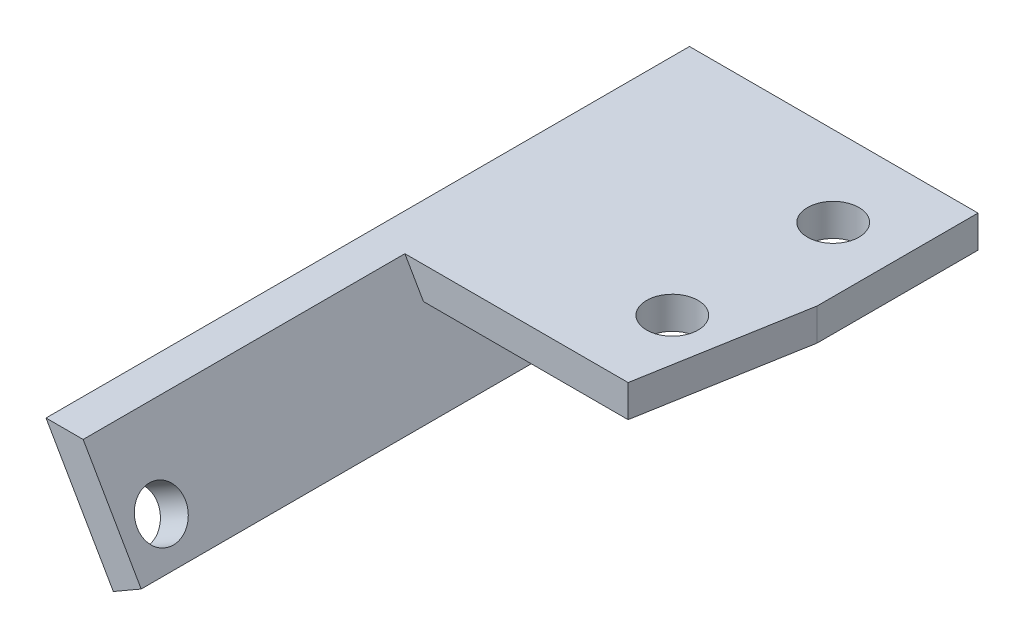
ISO-10303-21;
HEADER;
FILE_DESCRIPTION(('STEP AP214'),'2;1');
FILE_NAME('part.step','',(''),(''),'','','');
FILE_SCHEMA(('AUTOMOTIVE_DESIGN { 1 0 10303 214 1 1 1 1 }'));
ENDSEC;
DATA;
#1=APPLICATION_CONTEXT('core data for automotive mechanical design processes');
#2=APPLICATION_PROTOCOL_DEFINITION('international standard','automotive_design',2000,#1);
#3=PRODUCT_CONTEXT('',#1,'mechanical');
#4=PRODUCT('Part','Part','',(#3));
#5=PRODUCT_RELATED_PRODUCT_CATEGORY('part','',(#4));
#6=PRODUCT_DEFINITION_FORMATION('','',#4);
#7=PRODUCT_DEFINITION_CONTEXT('part definition',#1,'design');
#8=PRODUCT_DEFINITION('design','',#6,#7);
#9=PRODUCT_DEFINITION_SHAPE('','',#8);
#10=(LENGTH_UNIT() NAMED_UNIT(*) SI_UNIT(.MILLI.,.METRE.));
#11=(NAMED_UNIT(*) PLANE_ANGLE_UNIT() SI_UNIT($,.RADIAN.));
#12=(NAMED_UNIT(*) SI_UNIT($,.STERADIAN.) SOLID_ANGLE_UNIT());
#13=UNCERTAINTY_MEASURE_WITH_UNIT(LENGTH_MEASURE(1.E-05),#10,'distance_accuracy_value','');
#14=(GEOMETRIC_REPRESENTATION_CONTEXT(3) GLOBAL_UNCERTAINTY_ASSIGNED_CONTEXT((#13)) GLOBAL_UNIT_ASSIGNED_CONTEXT((#10,
#11,#12)) REPRESENTATION_CONTEXT('',''));
#15=CARTESIAN_POINT('',(0.,0.,0.));
#16=DIRECTION('',(0.,0.,1.));
#17=DIRECTION('',(1.,0.,0.));
#18=AXIS2_PLACEMENT_3D('',#15,#16,#17);
#19=CARTESIAN_POINT('',(0.,0.,20.));
#20=DIRECTION('',(-0.500000000000004,0.866025403784436,0.));
#21=DIRECTION('',(-0.866025403784436,-0.500000000000004,0.));
#22=AXIS2_PLACEMENT_3D('',#19,#20,#21);
#23=PLANE('',#22);
#24=DIRECTION('',(0.866025403784436,0.500000000000004,0.));
#25=VECTOR('',#24,1.);
#26=CARTESIAN_POINT('',(0.,0.,0.));
#27=LINE('',#26,#25);
#28=CARTESIAN_POINT('',(0.,0.,0.));
#29=VERTEX_POINT('',#28);
#30=CARTESIAN_POINT('',(1.73205080756887,1.00000000000001,0.));
#31=VERTEX_POINT('',#30);
#32=EDGE_CURVE('E107',#29,#31,#27,.T.);
#33=ORIENTED_EDGE('',*,*,#32,.T.);
#34=DIRECTION('',(0.,0.,-1.));
#35=VECTOR('',#34,1.);
#36=CARTESIAN_POINT('',(1.73205080756887,1.00000000000001,20.));
#37=LINE('',#36,#35);
#38=CARTESIAN_POINT('',(1.73205080756887,1.00000000000001,40.));
#39=VERTEX_POINT('',#38);
#40=EDGE_CURVE('E120',#39,#31,#37,.T.);
#41=ORIENTED_EDGE('',*,*,#40,.F.);
#42=DIRECTION('',(0.866025403784436,0.500000000000004,0.));
#43=VECTOR('',#42,1.);
#44=CARTESIAN_POINT('',(0.,0.,40.));
#45=LINE('',#44,#43);
#46=CARTESIAN_POINT('',(0.,0.,40.));
#47=VERTEX_POINT('',#46);
#48=EDGE_CURVE('E235',#47,#39,#45,.T.);
#49=ORIENTED_EDGE('',*,*,#48,.F.);
#50=DIRECTION('',(0.,0.,-1.));
#51=VECTOR('',#50,1.);
#52=CARTESIAN_POINT('',(0.,0.,20.));
#53=LINE('',#52,#51);
#54=EDGE_CURVE('E102',#47,#29,#53,.T.);
#55=ORIENTED_EDGE('',*,*,#54,.T.);
#56=EDGE_LOOP('',(#33,#41,#49,#55));
#57=FACE_BOUND('',#56,.T.);
#58=ADVANCED_FACE('F32',(#57),#23,.F.);
#59=CARTESIAN_POINT('',(1.73205080756887,1.00000000000001,20.));
#60=DIRECTION('',(-0.866025403784436,-0.500000000000004,0.));
#61=DIRECTION('',(0.500000000000005,-0.866025403784436,0.));
#62=AXIS2_PLACEMENT_3D('',#59,#60,#61);
#63=PLANE('',#62);
#64=CARTESIAN_POINT('',(0.48205080756886,3.1650635094611,2.5));
#65=DIRECTION('',(-0.866025403784436,-0.500000000000004,0.));
#66=DIRECTION('',(0.500000000000005,-0.866025403784436,0.));
#67=AXIS2_PLACEMENT_3D('',#64,#65,#66);
#68=CIRCLE('',#67,1.5);
#69=CARTESIAN_POINT('',(1.23205080756887,1.86602540378444,2.5));
#70=VERTEX_POINT('',#69);
#71=EDGE_CURVE('E222',#70,#70,#68,.F.);
#72=ORIENTED_EDGE('',*,*,#71,.F.);
#73=EDGE_LOOP('',(#72));
#74=FACE_BOUND('',#73,.T.);
#75=CARTESIAN_POINT('',(0.48205080756886,3.1650635094611,37.5));
#76=DIRECTION('',(-0.866025403784436,-0.500000000000004,0.));
#77=DIRECTION('',(0.500000000000005,-0.866025403784436,0.));
#78=AXIS2_PLACEMENT_3D('',#75,#76,#77);
#79=CIRCLE('',#78,1.5);
#80=CARTESIAN_POINT('',(1.23205080756887,1.86602540378444,37.5));
#81=VERTEX_POINT('',#80);
#82=EDGE_CURVE('E229',#81,#81,#79,.F.);
#83=ORIENTED_EDGE('',*,*,#82,.F.);
#84=EDGE_LOOP('',(#83));
#85=FACE_BOUND('',#84,.T.);
#86=DIRECTION('',(-0.500000000000004,0.866025403784436,0.));
#87=VECTOR('',#86,1.);
#88=CARTESIAN_POINT('',(1.73205080756887,1.00000000000001,0.));
#89=LINE('',#88,#87);
#90=CARTESIAN_POINT('',(-0.721687836487061,5.25,0.));
#91=VERTEX_POINT('',#90);
#92=EDGE_CURVE('E136',#31,#91,#89,.T.);
#93=ORIENTED_EDGE('',*,*,#92,.T.);
#94=DIRECTION('',(0.,0.,-1.));
#95=VECTOR('',#94,1.);
#96=CARTESIAN_POINT('',(-0.721687836487061,5.25,20.));
#97=LINE('',#96,#95);
#98=CARTESIAN_POINT('',(-0.721687836487061,5.25,20.));
#99=VERTEX_POINT('',#98);
#100=EDGE_CURVE('E118',#99,#91,#97,.T.);
#101=ORIENTED_EDGE('',*,*,#100,.F.);
#102=DIRECTION('',(-0.500000000000005,0.866025403784436,0.));
#103=VECTOR('',#102,1.);
#104=CARTESIAN_POINT('',(1.73205080756887,1.00000000000001,20.));
#105=LINE('',#104,#103);
#106=CARTESIAN_POINT('',(-1.87638837486633,7.25,20.));
#107=VERTEX_POINT('',#106);
#108=EDGE_CURVE('E39',#99,#107,#105,.T.);
#109=ORIENTED_EDGE('',*,*,#108,.T.);
#110=DIRECTION('',(0.,0.,-1.));
#111=VECTOR('',#110,1.);
#112=CARTESIAN_POINT('',(-1.87638837486633,7.25,40.));
#113=LINE('',#112,#111);
#114=CARTESIAN_POINT('',(-1.87638837486633,7.25,40.));
#115=VERTEX_POINT('',#114);
#116=EDGE_CURVE('E132',#115,#107,#113,.T.);
#117=ORIENTED_EDGE('',*,*,#116,.F.);
#118=DIRECTION('',(-0.500000000000005,0.866025403784436,0.));
#119=VECTOR('',#118,1.);
#120=CARTESIAN_POINT('',(1.73205080756887,1.00000000000001,40.));
#121=LINE('',#120,#119);
#122=EDGE_CURVE('E130',#39,#115,#121,.T.);
#123=ORIENTED_EDGE('',*,*,#122,.F.);
#124=ORIENTED_EDGE('',*,*,#40,.T.);
#125=EDGE_LOOP('',(#93,#101,#109,#117,#123,#124));
#126=FACE_BOUND('',#125,.T.);
#127=ADVANCED_FACE('F151',(#74,#85,#126),#63,.F.);
#128=CARTESIAN_POINT('',(-0.721687836487061,5.25,20.));
#129=DIRECTION('',(0.,1.,0.));
#130=DIRECTION('',(0.,0.,1.));
#131=AXIS2_PLACEMENT_3D('',#128,#129,#130);
#132=PLANE('',#131);
#133=CARTESIAN_POINT('',(9.75,5.25,15.));
#134=DIRECTION('',(0.,-1.,0.));
#135=DIRECTION('',(0.,0.,-1.));
#136=AXIS2_PLACEMENT_3D('',#133,#134,#135);
#137=CIRCLE('',#136,1.6);
#138=CARTESIAN_POINT('',(9.75,5.25,13.4));
#139=VERTEX_POINT('',#138);
#140=EDGE_CURVE('E214',#139,#139,#137,.T.);
#141=ORIENTED_EDGE('',*,*,#140,.F.);
#142=EDGE_LOOP('',(#141));
#143=FACE_BOUND('',#142,.T.);
#144=CARTESIAN_POINT('',(9.75,5.25,5.));
#145=DIRECTION('',(0.,-1.,0.));
#146=DIRECTION('',(0.,0.,-1.));
#147=AXIS2_PLACEMENT_3D('',#144,#145,#146);
#148=CIRCLE('',#147,1.6);
#149=CARTESIAN_POINT('',(9.75,5.25,3.4));
#150=VERTEX_POINT('',#149);
#151=EDGE_CURVE('E209',#150,#150,#148,.T.);
#152=ORIENTED_EDGE('',*,*,#151,.F.);
#153=EDGE_LOOP('',(#152));
#154=FACE_BOUND('',#153,.T.);
#155=DIRECTION('',(0.,0.,-1.));
#156=VECTOR('',#155,1.);
#157=CARTESIAN_POINT('',(13.75,5.25,20.));
#158=LINE('',#157,#156);
#159=CARTESIAN_POINT('',(13.75,5.25,10.));
#160=VERTEX_POINT('',#159);
#161=CARTESIAN_POINT('',(13.75,5.25,0.));
#162=VERTEX_POINT('',#161);
#163=EDGE_CURVE('E116',#160,#162,#158,.T.);
#164=ORIENTED_EDGE('',*,*,#163,.F.);
#165=DIRECTION('',(-0.172380331752248,0.,0.985030467155704));
#166=VECTOR('',#165,1.);
#167=CARTESIAN_POINT('',(11.6219753159564,5.25,22.1601410516776));
#168=LINE('',#167,#166);
#169=CARTESIAN_POINT('',(12.,5.25,20.));
#170=VERTEX_POINT('',#169);
#171=EDGE_CURVE('E203',#160,#170,#168,.T.);
#172=ORIENTED_EDGE('',*,*,#171,.T.);
#173=DIRECTION('',(1.,0.,0.));
#174=VECTOR('',#173,1.);
#175=CARTESIAN_POINT('',(-0.721687836487061,5.25,20.));
#176=LINE('',#175,#174);
#177=EDGE_CURVE('E108',#99,#170,#176,.T.);
#178=ORIENTED_EDGE('',*,*,#177,.F.);
#179=ORIENTED_EDGE('',*,*,#100,.T.);
#180=DIRECTION('',(1.,0.,0.));
#181=VECTOR('',#180,1.);
#182=CARTESIAN_POINT('',(-0.721687836487061,5.25,0.));
#183=LINE('',#182,#181);
#184=EDGE_CURVE('E138',#91,#162,#183,.T.);
#185=ORIENTED_EDGE('',*,*,#184,.T.);
#186=EDGE_LOOP('',(#164,#172,#178,#179,#185));
#187=FACE_BOUND('',#186,.T.);
#188=ADVANCED_FACE('F147',(#143,#154,#187),#132,.F.);
#189=CARTESIAN_POINT('',(13.75,5.25,20.));
#190=DIRECTION('',(-1.,0.,0.));
#191=DIRECTION('',(0.,-1.,0.));
#192=AXIS2_PLACEMENT_3D('',#189,#190,#191);
#193=PLANE('',#192);
#194=DIRECTION('',(0.,0.,-1.));
#195=VECTOR('',#194,1.);
#196=CARTESIAN_POINT('',(13.75,7.25,20.));
#197=LINE('',#196,#195);
#198=CARTESIAN_POINT('',(13.75,7.25,10.));
#199=VERTEX_POINT('',#198);
#200=CARTESIAN_POINT('',(13.75,7.25,0.));
#201=VERTEX_POINT('',#200);
#202=EDGE_CURVE('E87',#199,#201,#197,.T.);
#203=ORIENTED_EDGE('',*,*,#202,.F.);
#204=DIRECTION('',(0.,1.,0.));
#205=VECTOR('',#204,1.);
#206=CARTESIAN_POINT('',(13.75,0.,10.));
#207=LINE('',#206,#205);
#208=EDGE_CURVE('E202',#160,#199,#207,.T.);
#209=ORIENTED_EDGE('',*,*,#208,.F.);
#210=ORIENTED_EDGE('',*,*,#163,.T.);
#211=DIRECTION('',(0.,1.,0.));
#212=VECTOR('',#211,1.);
#213=CARTESIAN_POINT('',(13.75,5.25,0.));
#214=LINE('',#213,#212);
#215=EDGE_CURVE('E93',#162,#201,#214,.T.);
#216=ORIENTED_EDGE('',*,*,#215,.T.);
#217=EDGE_LOOP('',(#203,#209,#210,#216));
#218=FACE_BOUND('',#217,.T.);
#219=ADVANCED_FACE('F141',(#218),#193,.F.);
#220=CARTESIAN_POINT('',(-4.18578945162483,7.25,20.));
#221=DIRECTION('',(0.,-1.,0.));
#222=DIRECTION('',(1.,0.,0.));
#223=AXIS2_PLACEMENT_3D('',#220,#221,#222);
#224=PLANE('',#223);
#225=CARTESIAN_POINT('',(9.75,7.25,15.));
#226=DIRECTION('',(0.,-1.,0.));
#227=DIRECTION('',(0.,0.,-1.));
#228=AXIS2_PLACEMENT_3D('',#225,#226,#227);
#229=CIRCLE('',#228,1.6);
#230=CARTESIAN_POINT('',(9.75,7.25,13.4));
#231=VERTEX_POINT('',#230);
#232=EDGE_CURVE('E210',#231,#231,#229,.T.);
#233=ORIENTED_EDGE('',*,*,#232,.T.);
#234=EDGE_LOOP('',(#233));
#235=FACE_BOUND('',#234,.T.);
#236=CARTESIAN_POINT('',(9.75,7.25,5.));
#237=DIRECTION('',(0.,-1.,0.));
#238=DIRECTION('',(0.,0.,-1.));
#239=AXIS2_PLACEMENT_3D('',#236,#237,#238);
#240=CIRCLE('',#239,1.6);
#241=CARTESIAN_POINT('',(9.75,7.25,3.4));
#242=VERTEX_POINT('',#241);
#243=EDGE_CURVE('E217',#242,#242,#240,.T.);
#244=ORIENTED_EDGE('',*,*,#243,.T.);
#245=EDGE_LOOP('',(#244));
#246=FACE_BOUND('',#245,.T.);
#247=DIRECTION('',(-1.,0.,0.));
#248=VECTOR('',#247,1.);
#249=CARTESIAN_POINT('',(-4.18578945162483,7.25,20.));
#250=LINE('',#249,#248);
#251=CARTESIAN_POINT('',(12.,7.25,20.));
#252=VERTEX_POINT('',#251);
#253=EDGE_CURVE('E110',#252,#107,#250,.T.);
#254=ORIENTED_EDGE('',*,*,#253,.F.);
#255=DIRECTION('',(-0.172380331752248,0.,0.985030467155704));
#256=VECTOR('',#255,1.);
#257=CARTESIAN_POINT('',(13.75,7.25,10.));
#258=LINE('',#257,#256);
#259=EDGE_CURVE('E45',#199,#252,#258,.T.);
#260=ORIENTED_EDGE('',*,*,#259,.F.);
#261=ORIENTED_EDGE('',*,*,#202,.T.);
#262=DIRECTION('',(-1.,0.,0.));
#263=VECTOR('',#262,1.);
#264=CARTESIAN_POINT('',(-4.18578945162483,7.25,0.));
#265=LINE('',#264,#263);
#266=CARTESIAN_POINT('',(-4.18578945162483,7.25,0.));
#267=VERTEX_POINT('',#266);
#268=EDGE_CURVE('E78',#201,#267,#265,.T.);
#269=ORIENTED_EDGE('',*,*,#268,.T.);
#270=DIRECTION('',(0.,0.,-1.));
#271=VECTOR('',#270,1.);
#272=CARTESIAN_POINT('',(-4.18578945162483,7.25,20.));
#273=LINE('',#272,#271);
#274=CARTESIAN_POINT('',(-4.18578945162483,7.25,40.));
#275=VERTEX_POINT('',#274);
#276=EDGE_CURVE('E84',#275,#267,#273,.T.);
#277=ORIENTED_EDGE('',*,*,#276,.F.);
#278=DIRECTION('',(-1.,0.,0.));
#279=VECTOR('',#278,1.);
#280=CARTESIAN_POINT('',(-1.87638837486633,7.25,40.));
#281=LINE('',#280,#279);
#282=EDGE_CURVE('E225',#115,#275,#281,.T.);
#283=ORIENTED_EDGE('',*,*,#282,.F.);
#284=ORIENTED_EDGE('',*,*,#116,.T.);
#285=EDGE_LOOP('',(#254,#260,#261,#269,#277,#283,#284));
#286=FACE_BOUND('',#285,.T.);
#287=ADVANCED_FACE('F81',(#235,#246,#286),#224,.F.);
#288=CARTESIAN_POINT('',(0.,0.,20.));
#289=DIRECTION('',(0.866025403784436,0.500000000000004,0.));
#290=DIRECTION('',(-0.500000000000004,0.866025403784436,0.));
#291=AXIS2_PLACEMENT_3D('',#288,#289,#290);
#292=PLANE('',#291);
#293=CARTESIAN_POINT('',(-1.25000000000001,2.16506350946109,2.5));
#294=DIRECTION('',(-0.866025403784436,-0.500000000000004,0.));
#295=DIRECTION('',(0.500000000000004,-0.866025403784436,0.));
#296=AXIS2_PLACEMENT_3D('',#293,#294,#295);
#297=CIRCLE('',#296,1.5);
#298=CARTESIAN_POINT('',(-0.500000000000004,0.866025403784436,2.5));
#299=VERTEX_POINT('',#298);
#300=EDGE_CURVE('E226',#299,#299,#297,.T.);
#301=ORIENTED_EDGE('',*,*,#300,.F.);
#302=EDGE_LOOP('',(#301));
#303=FACE_BOUND('',#302,.T.);
#304=CARTESIAN_POINT('',(-1.25000000000001,2.16506350946109,37.5));
#305=DIRECTION('',(-0.866025403784436,-0.500000000000004,0.));
#306=DIRECTION('',(0.500000000000004,-0.866025403784436,0.));
#307=AXIS2_PLACEMENT_3D('',#304,#305,#306);
#308=CIRCLE('',#307,1.5);
#309=CARTESIAN_POINT('',(-0.500000000000003,0.866025403784433,37.5));
#310=VERTEX_POINT('',#309);
#311=EDGE_CURVE('E213',#310,#310,#308,.T.);
#312=ORIENTED_EDGE('',*,*,#311,.F.);
#313=EDGE_LOOP('',(#312));
#314=FACE_BOUND('',#313,.T.);
#315=DIRECTION('',(0.500000000000004,-0.866025403784436,0.));
#316=VECTOR('',#315,1.);
#317=CARTESIAN_POINT('',(0.,0.,0.));
#318=LINE('',#317,#316);
#319=EDGE_CURVE('E92',#267,#29,#318,.T.);
#320=ORIENTED_EDGE('',*,*,#319,.T.);
#321=ORIENTED_EDGE('',*,*,#54,.F.);
#322=DIRECTION('',(0.500000000000004,-0.866025403784436,0.));
#323=VECTOR('',#322,1.);
#324=CARTESIAN_POINT('',(-4.18578945162483,7.25,40.));
#325=LINE('',#324,#323);
#326=EDGE_CURVE('E100',#275,#47,#325,.T.);
#327=ORIENTED_EDGE('',*,*,#326,.F.);
#328=ORIENTED_EDGE('',*,*,#276,.T.);
#329=EDGE_LOOP('',(#320,#321,#327,#328));
#330=FACE_BOUND('',#329,.T.);
#331=ADVANCED_FACE('F96',(#303,#314,#330),#292,.F.);
#332=CARTESIAN_POINT('',(0.,0.,20.));
#333=DIRECTION('',(0.,0.,1.));
#334=DIRECTION('',(1.,0.,0.));
#335=AXIS2_PLACEMENT_3D('',#332,#333,#334);
#336=PLANE('',#335);
#337=DIRECTION('',(0.,-1.,0.));
#338=VECTOR('',#337,1.);
#339=CARTESIAN_POINT('',(12.,0.,20.));
#340=LINE('',#339,#338);
#341=EDGE_CURVE('E11',#252,#170,#340,.T.);
#342=ORIENTED_EDGE('',*,*,#341,.F.);
#343=ORIENTED_EDGE('',*,*,#253,.T.);
#344=ORIENTED_EDGE('',*,*,#108,.F.);
#345=ORIENTED_EDGE('',*,*,#177,.T.);
#346=EDGE_LOOP('',(#342,#343,#344,#345));
#347=FACE_BOUND('',#346,.T.);
#348=ADVANCED_FACE('F171',(#347),#336,.T.);
#349=CARTESIAN_POINT('',(0.,0.,0.));
#350=DIRECTION('',(0.,0.,1.));
#351=DIRECTION('',(1.,0.,0.));
#352=AXIS2_PLACEMENT_3D('',#349,#350,#351);
#353=PLANE('',#352);
#354=ORIENTED_EDGE('',*,*,#32,.F.);
#355=ORIENTED_EDGE('',*,*,#319,.F.);
#356=ORIENTED_EDGE('',*,*,#268,.F.);
#357=ORIENTED_EDGE('',*,*,#215,.F.);
#358=ORIENTED_EDGE('',*,*,#184,.F.);
#359=ORIENTED_EDGE('',*,*,#92,.F.);
#360=EDGE_LOOP('',(#354,#355,#356,#357,#358,#359));
#361=FACE_BOUND('',#360,.T.);
#362=ADVANCED_FACE('F105',(#361),#353,.F.);
#363=CARTESIAN_POINT('',(0.,0.,40.));
#364=DIRECTION('',(0.,0.,1.));
#365=DIRECTION('',(1.,0.,0.));
#366=AXIS2_PLACEMENT_3D('',#363,#364,#365);
#367=PLANE('',#366);
#368=ORIENTED_EDGE('',*,*,#282,.T.);
#369=ORIENTED_EDGE('',*,*,#326,.T.);
#370=ORIENTED_EDGE('',*,*,#48,.T.);
#371=ORIENTED_EDGE('',*,*,#122,.T.);
#372=EDGE_LOOP('',(#368,#369,#370,#371));
#373=FACE_BOUND('',#372,.T.);
#374=ADVANCED_FACE('F175',(#373),#367,.T.);
#375=CARTESIAN_POINT('',(12.2030251014204,9.93217117318106,37.5));
#376=DIRECTION('',(-0.866025403784436,-0.500000000000004,0.));
#377=DIRECTION('',(0.500000000000004,-0.866025403784436,0.));
#378=AXIS2_PLACEMENT_3D('',#375,#376,#377);
#379=CYLINDRICAL_SURFACE('',#378,1.5);
#380=ORIENTED_EDGE('',*,*,#311,.T.);
#381=EDGE_LOOP('',(#380));
#382=FACE_BOUND('',#381,.T.);
#383=ORIENTED_EDGE('',*,*,#82,.T.);
#384=EDGE_LOOP('',(#383));
#385=FACE_BOUND('',#384,.T.);
#386=ADVANCED_FACE('F180',(#382,#385),#379,.F.);
#387=CARTESIAN_POINT('',(12.2030251014204,9.93217117318106,2.5));
#388=DIRECTION('',(-0.866025403784436,-0.500000000000004,0.));
#389=DIRECTION('',(0.500000000000004,-0.866025403784436,0.));
#390=AXIS2_PLACEMENT_3D('',#387,#388,#389);
#391=CYLINDRICAL_SURFACE('',#390,1.5);
#392=ORIENTED_EDGE('',*,*,#300,.T.);
#393=EDGE_LOOP('',(#392));
#394=FACE_BOUND('',#393,.T.);
#395=ORIENTED_EDGE('',*,*,#71,.T.);
#396=EDGE_LOOP('',(#395));
#397=FACE_BOUND('',#396,.T.);
#398=ADVANCED_FACE('F184',(#394,#397),#391,.F.);
#399=CARTESIAN_POINT('',(9.75,7.25,5.));
#400=DIRECTION('',(0.,-1.,0.));
#401=DIRECTION('',(0.,0.,-1.));
#402=AXIS2_PLACEMENT_3D('',#399,#400,#401);
#403=CYLINDRICAL_SURFACE('',#402,1.6);
#404=ORIENTED_EDGE('',*,*,#243,.F.);
#405=EDGE_LOOP('',(#404));
#406=FACE_BOUND('',#405,.T.);
#407=ORIENTED_EDGE('',*,*,#151,.T.);
#408=EDGE_LOOP('',(#407));
#409=FACE_BOUND('',#408,.T.);
#410=ADVANCED_FACE('F188',(#406,#409),#403,.F.);
#411=CARTESIAN_POINT('',(9.75,7.25,15.));
#412=DIRECTION('',(0.,-1.,0.));
#413=DIRECTION('',(0.,0.,-1.));
#414=AXIS2_PLACEMENT_3D('',#411,#412,#413);
#415=CYLINDRICAL_SURFACE('',#414,1.6);
#416=ORIENTED_EDGE('',*,*,#232,.F.);
#417=EDGE_LOOP('',(#416));
#418=FACE_BOUND('',#417,.T.);
#419=ORIENTED_EDGE('',*,*,#140,.T.);
#420=EDGE_LOOP('',(#419));
#421=FACE_BOUND('',#420,.T.);
#422=ADVANCED_FACE('F192',(#418,#421),#415,.F.);
#423=CARTESIAN_POINT('',(13.75,0.,10.));
#424=DIRECTION('',(-0.985030467155704,0.,-0.172380331752248));
#425=DIRECTION('',(-0.172380331752248,0.,0.985030467155704));
#426=AXIS2_PLACEMENT_3D('',#423,#424,#425);
#427=PLANE('',#426);
#428=ORIENTED_EDGE('',*,*,#208,.T.);
#429=ORIENTED_EDGE('',*,*,#259,.T.);
#430=ORIENTED_EDGE('',*,*,#341,.T.);
#431=ORIENTED_EDGE('',*,*,#171,.F.);
#432=EDGE_LOOP('',(#428,#429,#430,#431));
#433=FACE_BOUND('',#432,.T.);
#434=ADVANCED_FACE('F196',(#433),#427,.F.);
#435=CLOSED_SHELL('',(#58,#127,#188,#219,#287,#331,#348,#362,#374,#386,#398,#410,#422,#434));
#436=MANIFOLD_SOLID_BREP('B2',#435);
#437=ADVANCED_BREP_SHAPE_REPRESENTATION('',(#18,#436),#14);
#438=SHAPE_DEFINITION_REPRESENTATION(#9,#437);
ENDSEC;
END-ISO-10303-21;
